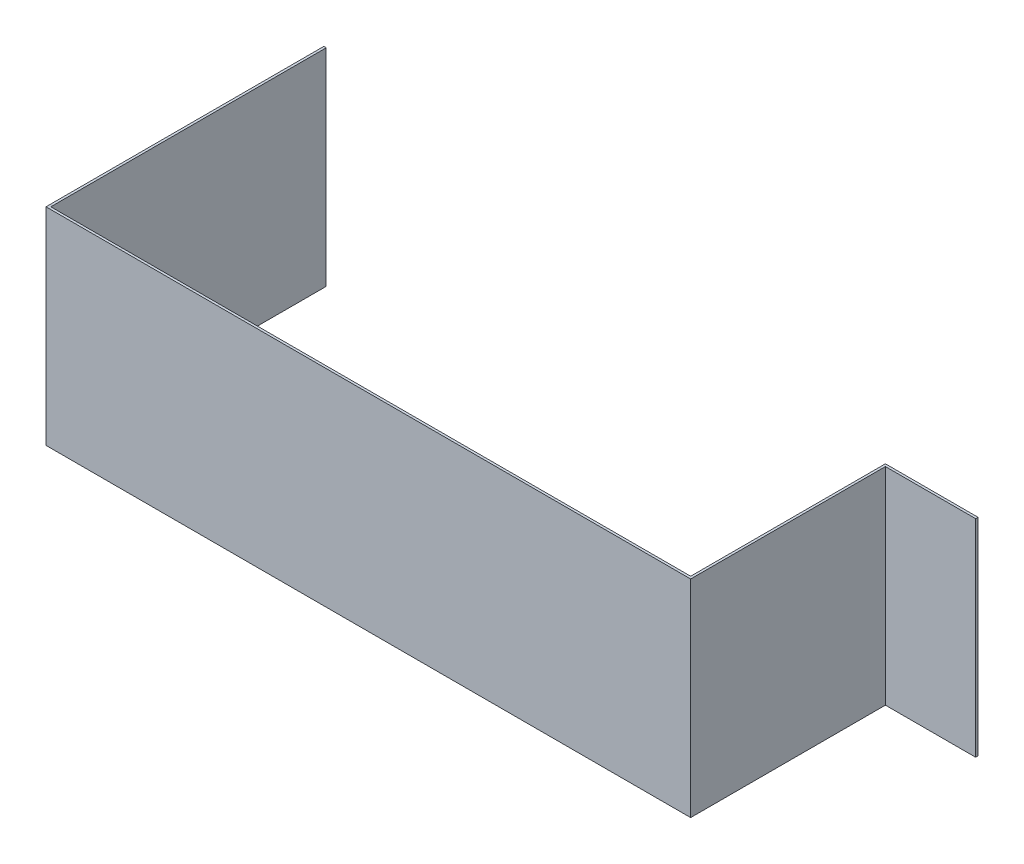
ISO-10303-21;
HEADER;
FILE_DESCRIPTION(('STEP AP214'),'2;1');
FILE_NAME('part.step','',(''),(''),'','','');
FILE_SCHEMA(('AUTOMOTIVE_DESIGN { 1 0 10303 214 1 1 1 1 }'));
ENDSEC;
DATA;
#1=APPLICATION_CONTEXT('core data for automotive mechanical design processes');
#2=APPLICATION_PROTOCOL_DEFINITION('international standard','automotive_design',2000,#1);
#3=PRODUCT_CONTEXT('',#1,'mechanical');
#4=PRODUCT('Part','Part','',(#3));
#5=PRODUCT_RELATED_PRODUCT_CATEGORY('part','',(#4));
#6=PRODUCT_DEFINITION_FORMATION('','',#4);
#7=PRODUCT_DEFINITION_CONTEXT('part definition',#1,'design');
#8=PRODUCT_DEFINITION('design','',#6,#7);
#9=PRODUCT_DEFINITION_SHAPE('','',#8);
#10=(LENGTH_UNIT() NAMED_UNIT(*) SI_UNIT(.MILLI.,.METRE.));
#11=(NAMED_UNIT(*) PLANE_ANGLE_UNIT() SI_UNIT($,.RADIAN.));
#12=(NAMED_UNIT(*) SI_UNIT($,.STERADIAN.) SOLID_ANGLE_UNIT());
#13=UNCERTAINTY_MEASURE_WITH_UNIT(LENGTH_MEASURE(1.E-05),#10,'distance_accuracy_value','');
#14=(GEOMETRIC_REPRESENTATION_CONTEXT(3) GLOBAL_UNCERTAINTY_ASSIGNED_CONTEXT((#13)) GLOBAL_UNIT_ASSIGNED_CONTEXT((#10,
#11,#12)) REPRESENTATION_CONTEXT('',''));
#15=CARTESIAN_POINT('',(0.,0.,0.));
#16=DIRECTION('',(0.,0.,1.));
#17=DIRECTION('',(1.,0.,0.));
#18=AXIS2_PLACEMENT_3D('',#15,#16,#17);
#19=CARTESIAN_POINT('',(54.675,16.2,4.6));
#20=DIRECTION('',(0.,0.,1.));
#21=DIRECTION('',(1.,0.,0.));
#22=AXIS2_PLACEMENT_3D('',#19,#20,#21);
#23=PLANE('',#22);
#24=DIRECTION('',(-1.,0.,0.));
#25=VECTOR('',#24,1.);
#26=CARTESIAN_POINT('',(54.675,3.2,4.6));
#27=LINE('',#26,#25);
#28=CARTESIAN_POINT('',(54.675,3.2,4.6));
#29=VERTEX_POINT('',#28);
#30=CARTESIAN_POINT('',(54.525,3.2,4.6));
#31=VERTEX_POINT('',#30);
#32=EDGE_CURVE('E147',#29,#31,#27,.T.);
#33=ORIENTED_EDGE('',*,*,#32,.T.);
#34=DIRECTION('',(0.,-1.,0.));
#35=VECTOR('',#34,1.);
#36=CARTESIAN_POINT('',(54.525,16.2,4.6));
#37=LINE('',#36,#35);
#38=CARTESIAN_POINT('',(54.525,16.2,4.6));
#39=VERTEX_POINT('',#38);
#40=EDGE_CURVE('E11',#39,#31,#37,.T.);
#41=ORIENTED_EDGE('',*,*,#40,.F.);
#42=DIRECTION('',(-1.,0.,0.));
#43=VECTOR('',#42,1.);
#44=CARTESIAN_POINT('',(54.675,16.2,4.6));
#45=LINE('',#44,#43);
#46=CARTESIAN_POINT('',(54.675,16.2,4.6));
#47=VERTEX_POINT('',#46);
#48=EDGE_CURVE('E165',#47,#39,#45,.T.);
#49=ORIENTED_EDGE('',*,*,#48,.F.);
#50=DIRECTION('',(0.,-1.,0.));
#51=VECTOR('',#50,1.);
#52=CARTESIAN_POINT('',(54.675,16.2,4.6));
#53=LINE('',#52,#51);
#54=EDGE_CURVE('E143',#47,#29,#53,.T.);
#55=ORIENTED_EDGE('',*,*,#54,.T.);
#56=EDGE_LOOP('',(#33,#41,#49,#55));
#57=FACE_BOUND('',#56,.T.);
#58=ADVANCED_FACE('F39',(#57),#23,.F.);
#59=CARTESIAN_POINT('',(54.525,16.2,4.6));
#60=DIRECTION('',(1.,0.,0.));
#61=DIRECTION('',(0.,0.,-1.));
#62=AXIS2_PLACEMENT_3D('',#59,#60,#61);
#63=PLANE('',#62);
#64=DIRECTION('',(0.,0.,1.));
#65=VECTOR('',#64,1.);
#66=CARTESIAN_POINT('',(54.525,3.2,4.6));
#67=LINE('',#66,#65);
#68=CARTESIAN_POINT('',(54.525,3.2,22.075));
#69=VERTEX_POINT('',#68);
#70=EDGE_CURVE('E150',#31,#69,#67,.T.);
#71=ORIENTED_EDGE('',*,*,#70,.T.);
#72=DIRECTION('',(0.,-1.,0.));
#73=VECTOR('',#72,1.);
#74=CARTESIAN_POINT('',(54.525,16.2,22.075));
#75=LINE('',#74,#73);
#76=CARTESIAN_POINT('',(54.525,16.2,22.075));
#77=VERTEX_POINT('',#76);
#78=EDGE_CURVE('E47',#77,#69,#75,.T.);
#79=ORIENTED_EDGE('',*,*,#78,.F.);
#80=DIRECTION('',(0.,0.,1.));
#81=VECTOR('',#80,1.);
#82=CARTESIAN_POINT('',(54.525,16.2,4.6));
#83=LINE('',#82,#81);
#84=EDGE_CURVE('E104',#39,#77,#83,.T.);
#85=ORIENTED_EDGE('',*,*,#84,.F.);
#86=ORIENTED_EDGE('',*,*,#40,.T.);
#87=EDGE_LOOP('',(#71,#79,#85,#86));
#88=FACE_BOUND('',#87,.T.);
#89=ADVANCED_FACE('F214',(#88),#63,.F.);
#90=CARTESIAN_POINT('',(54.525,16.2,22.075));
#91=DIRECTION('',(0.,0.,-1.));
#92=DIRECTION('',(-1.,0.,0.));
#93=AXIS2_PLACEMENT_3D('',#90,#91,#92);
#94=PLANE('',#93);
#95=DIRECTION('',(1.,0.,0.));
#96=VECTOR('',#95,1.);
#97=CARTESIAN_POINT('',(54.525,3.2,22.075));
#98=LINE('',#97,#96);
#99=CARTESIAN_POINT('',(95.075,3.2,22.075));
#100=VERTEX_POINT('',#99);
#101=EDGE_CURVE('E152',#69,#100,#98,.T.);
#102=ORIENTED_EDGE('',*,*,#101,.T.);
#103=DIRECTION('',(0.,-1.,0.));
#104=VECTOR('',#103,1.);
#105=CARTESIAN_POINT('',(95.075,16.2,22.075));
#106=LINE('',#105,#104);
#107=CARTESIAN_POINT('',(95.075,16.2,22.075));
#108=VERTEX_POINT('',#107);
#109=EDGE_CURVE('E178',#108,#100,#106,.T.);
#110=ORIENTED_EDGE('',*,*,#109,.F.);
#111=DIRECTION('',(1.,0.,0.));
#112=VECTOR('',#111,1.);
#113=CARTESIAN_POINT('',(54.525,16.2,22.075));
#114=LINE('',#113,#112);
#115=EDGE_CURVE('E186',#77,#108,#114,.T.);
#116=ORIENTED_EDGE('',*,*,#115,.F.);
#117=ORIENTED_EDGE('',*,*,#78,.T.);
#118=EDGE_LOOP('',(#102,#110,#116,#117));
#119=FACE_BOUND('',#118,.T.);
#120=ADVANCED_FACE('F184',(#119),#94,.F.);
#121=CARTESIAN_POINT('',(95.075,16.2,22.075));
#122=DIRECTION('',(-1.,0.,0.));
#123=DIRECTION('',(0.,0.,1.));
#124=AXIS2_PLACEMENT_3D('',#121,#122,#123);
#125=PLANE('',#124);
#126=DIRECTION('',(0.,0.,-1.));
#127=VECTOR('',#126,1.);
#128=CARTESIAN_POINT('',(95.075,3.2,22.075));
#129=LINE('',#128,#127);
#130=CARTESIAN_POINT('',(95.075,3.2,9.825));
#131=VERTEX_POINT('',#130);
#132=EDGE_CURVE('E154',#100,#131,#129,.T.);
#133=ORIENTED_EDGE('',*,*,#132,.T.);
#134=DIRECTION('',(0.,-1.,0.));
#135=VECTOR('',#134,1.);
#136=CARTESIAN_POINT('',(95.075,16.2,9.825));
#137=LINE('',#136,#135);
#138=CARTESIAN_POINT('',(95.075,16.2,9.825));
#139=VERTEX_POINT('',#138);
#140=EDGE_CURVE('E175',#139,#131,#137,.T.);
#141=ORIENTED_EDGE('',*,*,#140,.F.);
#142=DIRECTION('',(0.,0.,-1.));
#143=VECTOR('',#142,1.);
#144=CARTESIAN_POINT('',(95.075,16.2,22.075));
#145=LINE('',#144,#143);
#146=EDGE_CURVE('E204',#108,#139,#145,.T.);
#147=ORIENTED_EDGE('',*,*,#146,.F.);
#148=ORIENTED_EDGE('',*,*,#109,.T.);
#149=EDGE_LOOP('',(#133,#141,#147,#148));
#150=FACE_BOUND('',#149,.T.);
#151=ADVANCED_FACE('F195',(#150),#125,.F.);
#152=CARTESIAN_POINT('',(95.075,16.2,9.825));
#153=DIRECTION('',(0.,0.,-1.));
#154=DIRECTION('',(-1.,0.,0.));
#155=AXIS2_PLACEMENT_3D('',#152,#153,#154);
#156=PLANE('',#155);
#157=DIRECTION('',(1.,0.,0.));
#158=VECTOR('',#157,1.);
#159=CARTESIAN_POINT('',(95.075,3.2,9.825));
#160=LINE('',#159,#158);
#161=CARTESIAN_POINT('',(100.75,3.2,9.825));
#162=VERTEX_POINT('',#161);
#163=EDGE_CURVE('E156',#131,#162,#160,.T.);
#164=ORIENTED_EDGE('',*,*,#163,.T.);
#165=DIRECTION('',(0.,-1.,0.));
#166=VECTOR('',#165,1.);
#167=CARTESIAN_POINT('',(100.75,16.2,9.825));
#168=LINE('',#167,#166);
#169=CARTESIAN_POINT('',(100.75,16.2,9.825));
#170=VERTEX_POINT('',#169);
#171=EDGE_CURVE('E172',#170,#162,#168,.T.);
#172=ORIENTED_EDGE('',*,*,#171,.F.);
#173=DIRECTION('',(1.,0.,0.));
#174=VECTOR('',#173,1.);
#175=CARTESIAN_POINT('',(95.075,16.2,9.825));
#176=LINE('',#175,#174);
#177=EDGE_CURVE('E201',#139,#170,#176,.T.);
#178=ORIENTED_EDGE('',*,*,#177,.F.);
#179=ORIENTED_EDGE('',*,*,#140,.T.);
#180=EDGE_LOOP('',(#164,#172,#178,#179));
#181=FACE_BOUND('',#180,.T.);
#182=ADVANCED_FACE('F199',(#181),#156,.F.);
#183=CARTESIAN_POINT('',(100.75,16.2,9.825));
#184=DIRECTION('',(-1.,0.,0.));
#185=DIRECTION('',(0.,0.,1.));
#186=AXIS2_PLACEMENT_3D('',#183,#184,#185);
#187=PLANE('',#186);
#188=DIRECTION('',(0.,0.,-1.));
#189=VECTOR('',#188,1.);
#190=CARTESIAN_POINT('',(100.75,3.2,9.825));
#191=LINE('',#190,#189);
#192=CARTESIAN_POINT('',(100.75,3.2,9.675));
#193=VERTEX_POINT('',#192);
#194=EDGE_CURVE('E158',#162,#193,#191,.T.);
#195=ORIENTED_EDGE('',*,*,#194,.T.);
#196=DIRECTION('',(0.,-1.,0.));
#197=VECTOR('',#196,1.);
#198=CARTESIAN_POINT('',(100.75,16.2,9.675));
#199=LINE('',#198,#197);
#200=CARTESIAN_POINT('',(100.75,16.2,9.675));
#201=VERTEX_POINT('',#200);
#202=EDGE_CURVE('E169',#201,#193,#199,.T.);
#203=ORIENTED_EDGE('',*,*,#202,.F.);
#204=DIRECTION('',(0.,0.,-1.));
#205=VECTOR('',#204,1.);
#206=CARTESIAN_POINT('',(100.75,16.2,9.825));
#207=LINE('',#206,#205);
#208=EDGE_CURVE('E203',#170,#201,#207,.T.);
#209=ORIENTED_EDGE('',*,*,#208,.F.);
#210=ORIENTED_EDGE('',*,*,#171,.T.);
#211=EDGE_LOOP('',(#195,#203,#209,#210));
#212=FACE_BOUND('',#211,.T.);
#213=ADVANCED_FACE('F226',(#212),#187,.F.);
#214=CARTESIAN_POINT('',(100.75,16.2,9.675));
#215=DIRECTION('',(0.,0.,1.));
#216=DIRECTION('',(1.,0.,0.));
#217=AXIS2_PLACEMENT_3D('',#214,#215,#216);
#218=PLANE('',#217);
#219=DIRECTION('',(-1.,0.,0.));
#220=VECTOR('',#219,1.);
#221=CARTESIAN_POINT('',(100.75,3.2,9.675));
#222=LINE('',#221,#220);
#223=CARTESIAN_POINT('',(94.925,3.2,9.675));
#224=VERTEX_POINT('',#223);
#225=EDGE_CURVE('E160',#193,#224,#222,.T.);
#226=ORIENTED_EDGE('',*,*,#225,.T.);
#227=DIRECTION('',(0.,-1.,0.));
#228=VECTOR('',#227,1.);
#229=CARTESIAN_POINT('',(94.925,16.2,9.675));
#230=LINE('',#229,#228);
#231=CARTESIAN_POINT('',(94.925,16.2,9.675));
#232=VERTEX_POINT('',#231);
#233=EDGE_CURVE('E138',#232,#224,#230,.T.);
#234=ORIENTED_EDGE('',*,*,#233,.F.);
#235=DIRECTION('',(-1.,0.,0.));
#236=VECTOR('',#235,1.);
#237=CARTESIAN_POINT('',(100.75,16.2,9.675));
#238=LINE('',#237,#236);
#239=EDGE_CURVE('E129',#201,#232,#238,.T.);
#240=ORIENTED_EDGE('',*,*,#239,.F.);
#241=ORIENTED_EDGE('',*,*,#202,.T.);
#242=EDGE_LOOP('',(#226,#234,#240,#241));
#243=FACE_BOUND('',#242,.T.);
#244=ADVANCED_FACE('F229',(#243),#218,.F.);
#245=CARTESIAN_POINT('',(94.925,16.2,9.675));
#246=DIRECTION('',(1.,0.,0.));
#247=DIRECTION('',(0.,0.,-1.));
#248=AXIS2_PLACEMENT_3D('',#245,#246,#247);
#249=PLANE('',#248);
#250=DIRECTION('',(0.,0.,1.));
#251=VECTOR('',#250,1.);
#252=CARTESIAN_POINT('',(94.925,3.2,9.675));
#253=LINE('',#252,#251);
#254=CARTESIAN_POINT('',(94.925,3.2,21.925));
#255=VERTEX_POINT('',#254);
#256=EDGE_CURVE('E137',#224,#255,#253,.T.);
#257=ORIENTED_EDGE('',*,*,#256,.T.);
#258=DIRECTION('',(0.,-1.,0.));
#259=VECTOR('',#258,1.);
#260=CARTESIAN_POINT('',(94.925,16.2,21.925));
#261=LINE('',#260,#259);
#262=CARTESIAN_POINT('',(94.925,16.2,21.925));
#263=VERTEX_POINT('',#262);
#264=EDGE_CURVE('E134',#263,#255,#261,.T.);
#265=ORIENTED_EDGE('',*,*,#264,.F.);
#266=DIRECTION('',(0.,0.,1.));
#267=VECTOR('',#266,1.);
#268=CARTESIAN_POINT('',(94.925,16.2,9.675));
#269=LINE('',#268,#267);
#270=EDGE_CURVE('E123',#232,#263,#269,.T.);
#271=ORIENTED_EDGE('',*,*,#270,.F.);
#272=ORIENTED_EDGE('',*,*,#233,.T.);
#273=EDGE_LOOP('',(#257,#265,#271,#272));
#274=FACE_BOUND('',#273,.T.);
#275=ADVANCED_FACE('F135',(#274),#249,.F.);
#276=CARTESIAN_POINT('',(94.925,16.2,21.925));
#277=DIRECTION('',(0.,0.,1.));
#278=DIRECTION('',(1.,0.,0.));
#279=AXIS2_PLACEMENT_3D('',#276,#277,#278);
#280=PLANE('',#279);
#281=DIRECTION('',(-1.,0.,0.));
#282=VECTOR('',#281,1.);
#283=CARTESIAN_POINT('',(94.925,3.2,21.925));
#284=LINE('',#283,#282);
#285=CARTESIAN_POINT('',(54.675,3.2,21.925));
#286=VERTEX_POINT('',#285);
#287=EDGE_CURVE('E90',#255,#286,#284,.T.);
#288=ORIENTED_EDGE('',*,*,#287,.T.);
#289=DIRECTION('',(0.,-1.,0.));
#290=VECTOR('',#289,1.);
#291=CARTESIAN_POINT('',(54.675,16.2,21.925));
#292=LINE('',#291,#290);
#293=CARTESIAN_POINT('',(54.675,16.2,21.925));
#294=VERTEX_POINT('',#293);
#295=EDGE_CURVE('E139',#294,#286,#292,.T.);
#296=ORIENTED_EDGE('',*,*,#295,.F.);
#297=DIRECTION('',(-1.,0.,0.));
#298=VECTOR('',#297,1.);
#299=CARTESIAN_POINT('',(94.925,16.2,21.925));
#300=LINE('',#299,#298);
#301=EDGE_CURVE('E127',#263,#294,#300,.T.);
#302=ORIENTED_EDGE('',*,*,#301,.F.);
#303=ORIENTED_EDGE('',*,*,#264,.T.);
#304=EDGE_LOOP('',(#288,#296,#302,#303));
#305=FACE_BOUND('',#304,.T.);
#306=ADVANCED_FACE('F141',(#305),#280,.F.);
#307=CARTESIAN_POINT('',(54.675,16.2,21.925));
#308=DIRECTION('',(-1.,0.,0.));
#309=DIRECTION('',(0.,0.,1.));
#310=AXIS2_PLACEMENT_3D('',#307,#308,#309);
#311=PLANE('',#310);
#312=DIRECTION('',(0.,0.,-1.));
#313=VECTOR('',#312,1.);
#314=CARTESIAN_POINT('',(54.675,3.2,21.925));
#315=LINE('',#314,#313);
#316=EDGE_CURVE('E96',#286,#29,#315,.T.);
#317=ORIENTED_EDGE('',*,*,#316,.T.);
#318=ORIENTED_EDGE('',*,*,#54,.F.);
#319=DIRECTION('',(0.,0.,-1.));
#320=VECTOR('',#319,1.);
#321=CARTESIAN_POINT('',(54.675,16.2,21.925));
#322=LINE('',#321,#320);
#323=EDGE_CURVE('E55',#294,#47,#322,.T.);
#324=ORIENTED_EDGE('',*,*,#323,.F.);
#325=ORIENTED_EDGE('',*,*,#295,.T.);
#326=EDGE_LOOP('',(#317,#318,#324,#325));
#327=FACE_BOUND('',#326,.T.);
#328=ADVANCED_FACE('F238',(#327),#311,.F.);
#329=CARTESIAN_POINT('',(0.,16.2,0.));
#330=DIRECTION('',(0.,1.,0.));
#331=DIRECTION('',(0.,0.,1.));
#332=AXIS2_PLACEMENT_3D('',#329,#330,#331);
#333=PLANE('',#332);
#334=ORIENTED_EDGE('',*,*,#48,.T.);
#335=ORIENTED_EDGE('',*,*,#84,.T.);
#336=ORIENTED_EDGE('',*,*,#115,.T.);
#337=ORIENTED_EDGE('',*,*,#146,.T.);
#338=ORIENTED_EDGE('',*,*,#177,.T.);
#339=ORIENTED_EDGE('',*,*,#208,.T.);
#340=ORIENTED_EDGE('',*,*,#239,.T.);
#341=ORIENTED_EDGE('',*,*,#270,.T.);
#342=ORIENTED_EDGE('',*,*,#301,.T.);
#343=ORIENTED_EDGE('',*,*,#323,.T.);
#344=EDGE_LOOP('',(#334,#335,#336,#337,#338,#339,#340,#341,#342,#343));
#345=FACE_BOUND('',#344,.T.);
#346=ADVANCED_FACE('F125',(#345),#333,.T.);
#347=CARTESIAN_POINT('',(0.,3.2,0.));
#348=DIRECTION('',(0.,1.,0.));
#349=DIRECTION('',(0.,0.,1.));
#350=AXIS2_PLACEMENT_3D('',#347,#348,#349);
#351=PLANE('',#350);
#352=ORIENTED_EDGE('',*,*,#32,.F.);
#353=ORIENTED_EDGE('',*,*,#316,.F.);
#354=ORIENTED_EDGE('',*,*,#287,.F.);
#355=ORIENTED_EDGE('',*,*,#256,.F.);
#356=ORIENTED_EDGE('',*,*,#225,.F.);
#357=ORIENTED_EDGE('',*,*,#194,.F.);
#358=ORIENTED_EDGE('',*,*,#163,.F.);
#359=ORIENTED_EDGE('',*,*,#132,.F.);
#360=ORIENTED_EDGE('',*,*,#101,.F.);
#361=ORIENTED_EDGE('',*,*,#70,.F.);
#362=EDGE_LOOP('',(#352,#353,#354,#355,#356,#357,#358,#359,#360,#361));
#363=FACE_BOUND('',#362,.T.);
#364=ADVANCED_FACE('F190',(#363),#351,.F.);
#365=CLOSED_SHELL('',(#58,#89,#120,#151,#182,#213,#244,#275,#306,#328,#346,#364));
#366=MANIFOLD_SOLID_BREP('B2',#365);
#367=ADVANCED_BREP_SHAPE_REPRESENTATION('',(#18,#366),#14);
#368=SHAPE_DEFINITION_REPRESENTATION(#9,#367);
ENDSEC;
END-ISO-10303-21;
